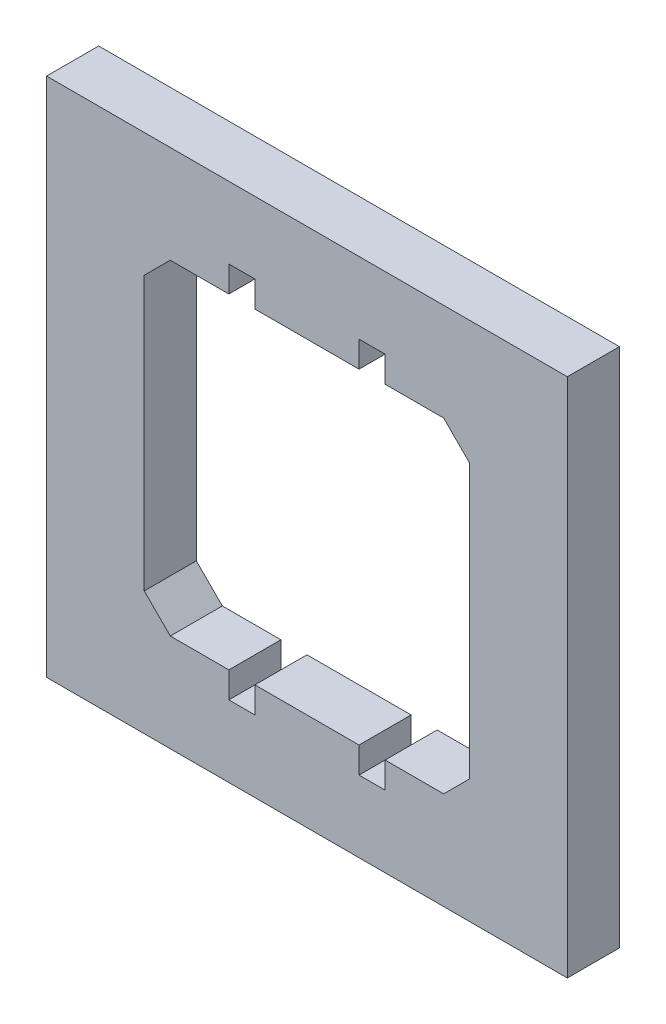
ISO-10303-21;
HEADER;
FILE_DESCRIPTION(('STEP AP214'),'2;1');
FILE_NAME('part.step','',(''),(''),'','','');
FILE_SCHEMA(('AUTOMOTIVE_DESIGN { 1 0 10303 214 1 1 1 1 }'));
ENDSEC;
DATA;
#1=APPLICATION_CONTEXT('core data for automotive mechanical design processes');
#2=APPLICATION_PROTOCOL_DEFINITION('international standard','automotive_design',2000,#1);
#3=PRODUCT_CONTEXT('',#1,'mechanical');
#4=PRODUCT('Part','Part','',(#3));
#5=PRODUCT_RELATED_PRODUCT_CATEGORY('part','',(#4));
#6=PRODUCT_DEFINITION_FORMATION('','',#4);
#7=PRODUCT_DEFINITION_CONTEXT('part definition',#1,'design');
#8=PRODUCT_DEFINITION('design','',#6,#7);
#9=PRODUCT_DEFINITION_SHAPE('','',#8);
#10=(LENGTH_UNIT() NAMED_UNIT(*) SI_UNIT(.MILLI.,.METRE.));
#11=(NAMED_UNIT(*) PLANE_ANGLE_UNIT() SI_UNIT($,.RADIAN.));
#12=(NAMED_UNIT(*) SI_UNIT($,.STERADIAN.) SOLID_ANGLE_UNIT());
#13=UNCERTAINTY_MEASURE_WITH_UNIT(LENGTH_MEASURE(1.E-05),#10,'distance_accuracy_value','');
#14=(GEOMETRIC_REPRESENTATION_CONTEXT(3) GLOBAL_UNCERTAINTY_ASSIGNED_CONTEXT((#13)) GLOBAL_UNIT_ASSIGNED_CONTEXT((#10,
#11,#12)) REPRESENTATION_CONTEXT('',''));
#15=CARTESIAN_POINT('',(0.,0.,0.));
#16=DIRECTION('',(0.,0.,1.));
#17=DIRECTION('',(1.,0.,0.));
#18=AXIS2_PLACEMENT_3D('',#15,#16,#17);
#19=CARTESIAN_POINT('',(0.,-6.25,2.));
#20=DIRECTION('',(0.,1.,0.));
#21=DIRECTION('',(0.,0.,1.));
#22=AXIS2_PLACEMENT_3D('',#19,#20,#21);
#23=PLANE('',#22);
#24=DIRECTION('',(1.,0.,0.));
#25=VECTOR('',#24,1.);
#26=CARTESIAN_POINT('',(0.,-6.25,2.));
#27=LINE('',#26,#25);
#28=CARTESIAN_POINT('',(3.,-6.25,2.));
#29=VERTEX_POINT('',#28);
#30=CARTESIAN_POINT('',(5.25,-6.25,2.));
#31=VERTEX_POINT('',#30);
#32=EDGE_CURVE('E560',#29,#31,#27,.T.);
#33=ORIENTED_EDGE('',*,*,#32,.T.);
#34=DIRECTION('',(0.,0.,-1.));
#35=VECTOR('',#34,1.);
#36=CARTESIAN_POINT('',(5.25,-6.25,0.));
#37=LINE('',#36,#35);
#38=CARTESIAN_POINT('',(5.25,-6.25,0.));
#39=VERTEX_POINT('',#38);
#40=EDGE_CURVE('E275',#31,#39,#37,.T.);
#41=ORIENTED_EDGE('',*,*,#40,.T.);
#42=DIRECTION('',(1.,0.,0.));
#43=VECTOR('',#42,1.);
#44=CARTESIAN_POINT('',(0.,-6.25,0.));
#45=LINE('',#44,#43);
#46=CARTESIAN_POINT('',(3.,-6.25,0.));
#47=VERTEX_POINT('',#46);
#48=EDGE_CURVE('E390',#47,#39,#45,.T.);
#49=ORIENTED_EDGE('',*,*,#48,.F.);
#50=DIRECTION('',(0.,0.,-1.));
#51=VECTOR('',#50,1.);
#52=CARTESIAN_POINT('',(3.,-6.25,2.));
#53=LINE('',#52,#51);
#54=EDGE_CURVE('E268',#29,#47,#53,.T.);
#55=ORIENTED_EDGE('',*,*,#54,.F.);
#56=EDGE_LOOP('',(#33,#41,#49,#55));
#57=FACE_BOUND('',#56,.T.);
#58=ADVANCED_FACE('F41',(#57),#23,.T.);
#59=CARTESIAN_POINT('',(3.,0.,2.));
#60=DIRECTION('',(1.,0.,0.));
#61=DIRECTION('',(0.,0.,-1.));
#62=AXIS2_PLACEMENT_3D('',#59,#60,#61);
#63=PLANE('',#62);
#64=DIRECTION('',(0.,-1.,0.));
#65=VECTOR('',#64,1.);
#66=CARTESIAN_POINT('',(3.,0.,0.));
#67=LINE('',#66,#65);
#68=CARTESIAN_POINT('',(3.,-7.25,0.));
#69=VERTEX_POINT('',#68);
#70=EDGE_CURVE('E393',#47,#69,#67,.T.);
#71=ORIENTED_EDGE('',*,*,#70,.T.);
#72=DIRECTION('',(0.,0.,-1.));
#73=VECTOR('',#72,1.);
#74=CARTESIAN_POINT('',(3.,-7.25,2.));
#75=LINE('',#74,#73);
#76=CARTESIAN_POINT('',(3.,-7.25,2.));
#77=VERTEX_POINT('',#76);
#78=EDGE_CURVE('E490',#77,#69,#75,.T.);
#79=ORIENTED_EDGE('',*,*,#78,.F.);
#80=DIRECTION('',(0.,-1.,0.));
#81=VECTOR('',#80,1.);
#82=CARTESIAN_POINT('',(3.,0.,2.));
#83=LINE('',#82,#81);
#84=EDGE_CURVE('E571',#29,#77,#83,.T.);
#85=ORIENTED_EDGE('',*,*,#84,.F.);
#86=ORIENTED_EDGE('',*,*,#54,.T.);
#87=EDGE_LOOP('',(#71,#79,#85,#86));
#88=FACE_BOUND('',#87,.T.);
#89=ADVANCED_FACE('F518',(#88),#63,.F.);
#90=CARTESIAN_POINT('',(0.,-7.25,2.));
#91=DIRECTION('',(0.,1.,0.));
#92=DIRECTION('',(-1.,0.,0.));
#93=AXIS2_PLACEMENT_3D('',#90,#91,#92);
#94=PLANE('',#93);
#95=DIRECTION('',(1.,0.,0.));
#96=VECTOR('',#95,1.);
#97=CARTESIAN_POINT('',(0.,-7.25,0.));
#98=LINE('',#97,#96);
#99=CARTESIAN_POINT('',(2.,-7.25,0.));
#100=VERTEX_POINT('',#99);
#101=EDGE_CURVE('E398',#100,#69,#98,.T.);
#102=ORIENTED_EDGE('',*,*,#101,.F.);
#103=DIRECTION('',(0.,0.,-1.));
#104=VECTOR('',#103,1.);
#105=CARTESIAN_POINT('',(2.,-7.25,2.));
#106=LINE('',#105,#104);
#107=CARTESIAN_POINT('',(2.,-7.25,2.));
#108=VERTEX_POINT('',#107);
#109=EDGE_CURVE('E487',#108,#100,#106,.T.);
#110=ORIENTED_EDGE('',*,*,#109,.F.);
#111=DIRECTION('',(1.,0.,0.));
#112=VECTOR('',#111,1.);
#113=CARTESIAN_POINT('',(0.,-7.25,2.));
#114=LINE('',#113,#112);
#115=EDGE_CURVE('E575',#108,#77,#114,.T.);
#116=ORIENTED_EDGE('',*,*,#115,.T.);
#117=ORIENTED_EDGE('',*,*,#78,.T.);
#118=EDGE_LOOP('',(#102,#110,#116,#117));
#119=FACE_BOUND('',#118,.T.);
#120=ADVANCED_FACE('F526',(#119),#94,.T.);
#121=CARTESIAN_POINT('',(2.,0.,2.));
#122=DIRECTION('',(1.,0.,0.));
#123=DIRECTION('',(0.,1.,0.));
#124=AXIS2_PLACEMENT_3D('',#121,#122,#123);
#125=PLANE('',#124);
#126=DIRECTION('',(0.,-1.,0.));
#127=VECTOR('',#126,1.);
#128=CARTESIAN_POINT('',(2.,0.,0.));
#129=LINE('',#128,#127);
#130=CARTESIAN_POINT('',(2.,-6.25,0.));
#131=VERTEX_POINT('',#130);
#132=EDGE_CURVE('E402',#131,#100,#129,.T.);
#133=ORIENTED_EDGE('',*,*,#132,.F.);
#134=DIRECTION('',(0.,0.,-1.));
#135=VECTOR('',#134,1.);
#136=CARTESIAN_POINT('',(2.,-6.25,2.));
#137=LINE('',#136,#135);
#138=CARTESIAN_POINT('',(2.,-6.25,2.));
#139=VERTEX_POINT('',#138);
#140=EDGE_CURVE('E484',#139,#131,#137,.T.);
#141=ORIENTED_EDGE('',*,*,#140,.F.);
#142=DIRECTION('',(0.,-1.,0.));
#143=VECTOR('',#142,1.);
#144=CARTESIAN_POINT('',(2.,0.,2.));
#145=LINE('',#144,#143);
#146=EDGE_CURVE('E569',#139,#108,#145,.T.);
#147=ORIENTED_EDGE('',*,*,#146,.T.);
#148=ORIENTED_EDGE('',*,*,#109,.T.);
#149=EDGE_LOOP('',(#133,#141,#147,#148));
#150=FACE_BOUND('',#149,.T.);
#151=ADVANCED_FACE('F534',(#150),#125,.T.);
#152=CARTESIAN_POINT('',(-2.,-6.25,0.));
#153=VERTEX_POINT('',#152);
#154=EDGE_CURVE('E394',#153,#131,#45,.T.);
#155=ORIENTED_EDGE('',*,*,#154,.F.);
#156=DIRECTION('',(0.,0.,-1.));
#157=VECTOR('',#156,1.);
#158=CARTESIAN_POINT('',(-2.,-6.25,2.));
#159=LINE('',#158,#157);
#160=CARTESIAN_POINT('',(-2.,-6.25,2.));
#161=VERTEX_POINT('',#160);
#162=EDGE_CURVE('E481',#161,#153,#159,.T.);
#163=ORIENTED_EDGE('',*,*,#162,.F.);
#164=EDGE_CURVE('E559',#161,#139,#27,.T.);
#165=ORIENTED_EDGE('',*,*,#164,.T.);
#166=ORIENTED_EDGE('',*,*,#140,.T.);
#167=EDGE_LOOP('',(#155,#163,#165,#166));
#168=FACE_BOUND('',#167,.T.);
#169=ADVANCED_FACE('F521',(#168),#23,.T.);
#170=CARTESIAN_POINT('',(-2.,0.,2.));
#171=DIRECTION('',(1.,0.,0.));
#172=DIRECTION('',(0.,1.,0.));
#173=AXIS2_PLACEMENT_3D('',#170,#171,#172);
#174=PLANE('',#173);
#175=DIRECTION('',(0.,-1.,0.));
#176=VECTOR('',#175,1.);
#177=CARTESIAN_POINT('',(-2.,0.,0.));
#178=LINE('',#177,#176);
#179=CARTESIAN_POINT('',(-2.,-7.25,0.));
#180=VERTEX_POINT('',#179);
#181=EDGE_CURVE('E406',#153,#180,#178,.T.);
#182=ORIENTED_EDGE('',*,*,#181,.T.);
#183=DIRECTION('',(0.,0.,-1.));
#184=VECTOR('',#183,1.);
#185=CARTESIAN_POINT('',(-2.,-7.25,2.));
#186=LINE('',#185,#184);
#187=CARTESIAN_POINT('',(-2.,-7.25,2.));
#188=VERTEX_POINT('',#187);
#189=EDGE_CURVE('E478',#188,#180,#186,.T.);
#190=ORIENTED_EDGE('',*,*,#189,.F.);
#191=DIRECTION('',(0.,-1.,0.));
#192=VECTOR('',#191,1.);
#193=CARTESIAN_POINT('',(-2.,0.,2.));
#194=LINE('',#193,#192);
#195=EDGE_CURVE('E568',#161,#188,#194,.T.);
#196=ORIENTED_EDGE('',*,*,#195,.F.);
#197=ORIENTED_EDGE('',*,*,#162,.T.);
#198=EDGE_LOOP('',(#182,#190,#196,#197));
#199=FACE_BOUND('',#198,.T.);
#200=ADVANCED_FACE('F533',(#199),#174,.F.);
#201=CARTESIAN_POINT('',(0.,-7.25,2.));
#202=DIRECTION('',(0.,1.,0.));
#203=DIRECTION('',(0.,0.,1.));
#204=AXIS2_PLACEMENT_3D('',#201,#202,#203);
#205=PLANE('',#204);
#206=DIRECTION('',(1.,0.,0.));
#207=VECTOR('',#206,1.);
#208=CARTESIAN_POINT('',(0.,-7.25,0.));
#209=LINE('',#208,#207);
#210=CARTESIAN_POINT('',(-3.,-7.25,0.));
#211=VERTEX_POINT('',#210);
#212=EDGE_CURVE('E410',#211,#180,#209,.T.);
#213=ORIENTED_EDGE('',*,*,#212,.F.);
#214=DIRECTION('',(0.,0.,-1.));
#215=VECTOR('',#214,1.);
#216=CARTESIAN_POINT('',(-3.,-7.25,2.));
#217=LINE('',#216,#215);
#218=CARTESIAN_POINT('',(-3.,-7.25,2.));
#219=VERTEX_POINT('',#218);
#220=EDGE_CURVE('E475',#219,#211,#217,.T.);
#221=ORIENTED_EDGE('',*,*,#220,.F.);
#222=DIRECTION('',(1.,0.,0.));
#223=VECTOR('',#222,1.);
#224=CARTESIAN_POINT('',(0.,-7.25,2.));
#225=LINE('',#224,#223);
#226=EDGE_CURVE('E562',#219,#188,#225,.T.);
#227=ORIENTED_EDGE('',*,*,#226,.T.);
#228=ORIENTED_EDGE('',*,*,#189,.T.);
#229=EDGE_LOOP('',(#213,#221,#227,#228));
#230=FACE_BOUND('',#229,.T.);
#231=ADVANCED_FACE('F543',(#230),#205,.T.);
#232=CARTESIAN_POINT('',(-3.00000000000001,0.,2.));
#233=DIRECTION('',(1.,0.,0.));
#234=DIRECTION('',(0.,1.,0.));
#235=AXIS2_PLACEMENT_3D('',#232,#233,#234);
#236=PLANE('',#235);
#237=DIRECTION('',(0.,-1.,0.));
#238=VECTOR('',#237,1.);
#239=CARTESIAN_POINT('',(-3.00000000000001,0.,0.));
#240=LINE('',#239,#238);
#241=CARTESIAN_POINT('',(-3.,-6.25,0.));
#242=VERTEX_POINT('',#241);
#243=EDGE_CURVE('E414',#242,#211,#240,.T.);
#244=ORIENTED_EDGE('',*,*,#243,.F.);
#245=DIRECTION('',(0.,0.,-1.));
#246=VECTOR('',#245,1.);
#247=CARTESIAN_POINT('',(-3.,-6.25,2.));
#248=LINE('',#247,#246);
#249=CARTESIAN_POINT('',(-3.,-6.25,2.));
#250=VERTEX_POINT('',#249);
#251=EDGE_CURVE('E471',#250,#242,#248,.T.);
#252=ORIENTED_EDGE('',*,*,#251,.F.);
#253=DIRECTION('',(0.,-1.,0.));
#254=VECTOR('',#253,1.);
#255=CARTESIAN_POINT('',(-3.00000000000001,0.,2.));
#256=LINE('',#255,#254);
#257=EDGE_CURVE('E556',#250,#219,#256,.T.);
#258=ORIENTED_EDGE('',*,*,#257,.T.);
#259=ORIENTED_EDGE('',*,*,#220,.T.);
#260=EDGE_LOOP('',(#244,#252,#258,#259));
#261=FACE_BOUND('',#260,.T.);
#262=ADVANCED_FACE('F537',(#261),#236,.T.);
#263=CARTESIAN_POINT('',(-5.25,-6.25,0.));
#264=VERTEX_POINT('',#263);
#265=EDGE_CURVE('E324',#264,#242,#45,.T.);
#266=ORIENTED_EDGE('',*,*,#265,.F.);
#267=DIRECTION('',(0.,0.,1.));
#268=VECTOR('',#267,1.);
#269=CARTESIAN_POINT('',(-5.25,-6.25,2.));
#270=LINE('',#269,#268);
#271=CARTESIAN_POINT('',(-5.25,-6.25,2.));
#272=VERTEX_POINT('',#271);
#273=EDGE_CURVE('E272',#264,#272,#270,.T.);
#274=ORIENTED_EDGE('',*,*,#273,.T.);
#275=EDGE_CURVE('E344',#272,#250,#27,.T.);
#276=ORIENTED_EDGE('',*,*,#275,.T.);
#277=ORIENTED_EDGE('',*,*,#251,.T.);
#278=EDGE_LOOP('',(#266,#274,#276,#277));
#279=FACE_BOUND('',#278,.T.);
#280=ADVANCED_FACE('F522',(#279),#23,.T.);
#281=CARTESIAN_POINT('',(-6.25,0.,2.));
#282=DIRECTION('',(-1.,0.,0.));
#283=DIRECTION('',(0.,0.,1.));
#284=AXIS2_PLACEMENT_3D('',#281,#282,#283);
#285=PLANE('',#284);
#286=DIRECTION('',(0.,1.,0.));
#287=VECTOR('',#286,1.);
#288=CARTESIAN_POINT('',(-6.25,0.,2.));
#289=LINE('',#288,#287);
#290=CARTESIAN_POINT('',(-6.25,-5.24999999999999,2.));
#291=VERTEX_POINT('',#290);
#292=CARTESIAN_POINT('',(-6.25,5.25000000000001,2.));
#293=VERTEX_POINT('',#292);
#294=EDGE_CURVE('E336',#291,#293,#289,.T.);
#295=ORIENTED_EDGE('',*,*,#294,.F.);
#296=DIRECTION('',(0.,0.,-1.));
#297=VECTOR('',#296,1.);
#298=CARTESIAN_POINT('',(-6.25,-5.24999999999999,2.));
#299=LINE('',#298,#297);
#300=CARTESIAN_POINT('',(-6.25,-5.24999999999999,0.));
#301=VERTEX_POINT('',#300);
#302=EDGE_CURVE('E267',#291,#301,#299,.T.);
#303=ORIENTED_EDGE('',*,*,#302,.T.);
#304=DIRECTION('',(0.,1.,0.));
#305=VECTOR('',#304,1.);
#306=CARTESIAN_POINT('',(-6.25,0.,0.));
#307=LINE('',#306,#305);
#308=CARTESIAN_POINT('',(-6.25,5.25000000000001,0.));
#309=VERTEX_POINT('',#308);
#310=EDGE_CURVE('E316',#301,#309,#307,.T.);
#311=ORIENTED_EDGE('',*,*,#310,.T.);
#312=DIRECTION('',(0.,0.,1.));
#313=VECTOR('',#312,1.);
#314=CARTESIAN_POINT('',(-6.25,5.25000000000001,2.));
#315=LINE('',#314,#313);
#316=EDGE_CURVE('E264',#309,#293,#315,.T.);
#317=ORIENTED_EDGE('',*,*,#316,.T.);
#318=EDGE_LOOP('',(#295,#303,#311,#317));
#319=FACE_BOUND('',#318,.T.);
#320=ADVANCED_FACE('F321',(#319),#285,.F.);
#321=CARTESIAN_POINT('',(0.,6.25,2.));
#322=DIRECTION('',(0.,1.,0.));
#323=DIRECTION('',(0.,0.,1.));
#324=AXIS2_PLACEMENT_3D('',#321,#322,#323);
#325=PLANE('',#324);
#326=DIRECTION('',(1.,0.,0.));
#327=VECTOR('',#326,1.);
#328=CARTESIAN_POINT('',(0.,6.25,2.));
#329=LINE('',#328,#327);
#330=CARTESIAN_POINT('',(-5.24999999999999,6.25,2.));
#331=VERTEX_POINT('',#330);
#332=CARTESIAN_POINT('',(-3.,6.25,2.));
#333=VERTEX_POINT('',#332);
#334=EDGE_CURVE('E329',#331,#333,#329,.T.);
#335=ORIENTED_EDGE('',*,*,#334,.F.);
#336=DIRECTION('',(0.,0.,-1.));
#337=VECTOR('',#336,1.);
#338=CARTESIAN_POINT('',(-5.24999999999999,6.25,0.));
#339=LINE('',#338,#337);
#340=CARTESIAN_POINT('',(-5.24999999999999,6.25,0.));
#341=VERTEX_POINT('',#340);
#342=EDGE_CURVE('E289',#331,#341,#339,.T.);
#343=ORIENTED_EDGE('',*,*,#342,.T.);
#344=DIRECTION('',(1.,0.,0.));
#345=VECTOR('',#344,1.);
#346=CARTESIAN_POINT('',(0.,6.25,0.));
#347=LINE('',#346,#345);
#348=CARTESIAN_POINT('',(-3.,6.25,0.));
#349=VERTEX_POINT('',#348);
#350=EDGE_CURVE('E318',#341,#349,#347,.T.);
#351=ORIENTED_EDGE('',*,*,#350,.T.);
#352=DIRECTION('',(0.,0.,-1.));
#353=VECTOR('',#352,1.);
#354=CARTESIAN_POINT('',(-3.,6.25,2.));
#355=LINE('',#354,#353);
#356=EDGE_CURVE('E331',#333,#349,#355,.T.);
#357=ORIENTED_EDGE('',*,*,#356,.F.);
#358=EDGE_LOOP('',(#335,#343,#351,#357));
#359=FACE_BOUND('',#358,.T.);
#360=ADVANCED_FACE('F327',(#359),#325,.F.);
#361=CARTESIAN_POINT('',(-3.,0.,2.));
#362=DIRECTION('',(-1.,0.,0.));
#363=DIRECTION('',(0.,0.,1.));
#364=AXIS2_PLACEMENT_3D('',#361,#362,#363);
#365=PLANE('',#364);
#366=DIRECTION('',(0.,1.,0.));
#367=VECTOR('',#366,1.);
#368=CARTESIAN_POINT('',(-3.,0.,0.));
#369=LINE('',#368,#367);
#370=CARTESIAN_POINT('',(-3.,7.25,0.));
#371=VERTEX_POINT('',#370);
#372=EDGE_CURVE('E420',#349,#371,#369,.T.);
#373=ORIENTED_EDGE('',*,*,#372,.T.);
#374=DIRECTION('',(0.,0.,-1.));
#375=VECTOR('',#374,1.);
#376=CARTESIAN_POINT('',(-3.,7.25,2.));
#377=LINE('',#376,#375);
#378=CARTESIAN_POINT('',(-3.,7.25,2.));
#379=VERTEX_POINT('',#378);
#380=EDGE_CURVE('E465',#379,#371,#377,.T.);
#381=ORIENTED_EDGE('',*,*,#380,.F.);
#382=DIRECTION('',(0.,1.,0.));
#383=VECTOR('',#382,1.);
#384=CARTESIAN_POINT('',(-3.,0.,2.));
#385=LINE('',#384,#383);
#386=EDGE_CURVE('E335',#333,#379,#385,.T.);
#387=ORIENTED_EDGE('',*,*,#386,.F.);
#388=ORIENTED_EDGE('',*,*,#356,.T.);
#389=EDGE_LOOP('',(#373,#381,#387,#388));
#390=FACE_BOUND('',#389,.T.);
#391=ADVANCED_FACE('F635',(#390),#365,.F.);
#392=CARTESIAN_POINT('',(0.,7.25,2.));
#393=DIRECTION('',(0.,1.,0.));
#394=DIRECTION('',(0.,0.,1.));
#395=AXIS2_PLACEMENT_3D('',#392,#393,#394);
#396=PLANE('',#395);
#397=DIRECTION('',(1.,0.,0.));
#398=VECTOR('',#397,1.);
#399=CARTESIAN_POINT('',(0.,7.25,0.));
#400=LINE('',#399,#398);
#401=CARTESIAN_POINT('',(-2.,7.25,0.));
#402=VERTEX_POINT('',#401);
#403=EDGE_CURVE('E426',#371,#402,#400,.T.);
#404=ORIENTED_EDGE('',*,*,#403,.T.);
#405=DIRECTION('',(0.,0.,-1.));
#406=VECTOR('',#405,1.);
#407=CARTESIAN_POINT('',(-2.,7.25,2.));
#408=LINE('',#407,#406);
#409=CARTESIAN_POINT('',(-2.,7.25,2.));
#410=VERTEX_POINT('',#409);
#411=EDGE_CURVE('E462',#410,#402,#408,.T.);
#412=ORIENTED_EDGE('',*,*,#411,.F.);
#413=DIRECTION('',(1.,0.,0.));
#414=VECTOR('',#413,1.);
#415=CARTESIAN_POINT('',(0.,7.25,2.));
#416=LINE('',#415,#414);
#417=EDGE_CURVE('E342',#379,#410,#416,.T.);
#418=ORIENTED_EDGE('',*,*,#417,.F.);
#419=ORIENTED_EDGE('',*,*,#380,.T.);
#420=EDGE_LOOP('',(#404,#412,#418,#419));
#421=FACE_BOUND('',#420,.T.);
#422=ADVANCED_FACE('F632',(#421),#396,.F.);
#423=CARTESIAN_POINT('',(-2.,0.,2.));
#424=DIRECTION('',(-1.,0.,0.));
#425=DIRECTION('',(0.,0.,1.));
#426=AXIS2_PLACEMENT_3D('',#423,#424,#425);
#427=PLANE('',#426);
#428=DIRECTION('',(0.,1.,0.));
#429=VECTOR('',#428,1.);
#430=CARTESIAN_POINT('',(-2.,0.,0.));
#431=LINE('',#430,#429);
#432=CARTESIAN_POINT('',(-2.,6.25,0.));
#433=VERTEX_POINT('',#432);
#434=EDGE_CURVE('E430',#433,#402,#431,.T.);
#435=ORIENTED_EDGE('',*,*,#434,.F.);
#436=DIRECTION('',(0.,0.,-1.));
#437=VECTOR('',#436,1.);
#438=CARTESIAN_POINT('',(-2.,6.25,2.));
#439=LINE('',#438,#437);
#440=CARTESIAN_POINT('',(-2.,6.25,2.));
#441=VERTEX_POINT('',#440);
#442=EDGE_CURVE('E459',#441,#433,#439,.T.);
#443=ORIENTED_EDGE('',*,*,#442,.F.);
#444=DIRECTION('',(0.,1.,0.));
#445=VECTOR('',#444,1.);
#446=CARTESIAN_POINT('',(-2.,0.,2.));
#447=LINE('',#446,#445);
#448=EDGE_CURVE('E353',#441,#410,#447,.T.);
#449=ORIENTED_EDGE('',*,*,#448,.T.);
#450=ORIENTED_EDGE('',*,*,#411,.T.);
#451=EDGE_LOOP('',(#435,#443,#449,#450));
#452=FACE_BOUND('',#451,.T.);
#453=ADVANCED_FACE('F629',(#452),#427,.T.);
#454=CARTESIAN_POINT('',(2.,6.25,0.));
#455=VERTEX_POINT('',#454);
#456=EDGE_CURVE('E422',#433,#455,#347,.T.);
#457=ORIENTED_EDGE('',*,*,#456,.T.);
#458=DIRECTION('',(0.,0.,-1.));
#459=VECTOR('',#458,1.);
#460=CARTESIAN_POINT('',(2.,6.25,2.));
#461=LINE('',#460,#459);
#462=CARTESIAN_POINT('',(2.,6.25,2.));
#463=VERTEX_POINT('',#462);
#464=EDGE_CURVE('E455',#463,#455,#461,.T.);
#465=ORIENTED_EDGE('',*,*,#464,.F.);
#466=EDGE_CURVE('E339',#441,#463,#329,.T.);
#467=ORIENTED_EDGE('',*,*,#466,.F.);
#468=ORIENTED_EDGE('',*,*,#442,.T.);
#469=EDGE_LOOP('',(#457,#465,#467,#468));
#470=FACE_BOUND('',#469,.T.);
#471=ADVANCED_FACE('F627',(#470),#325,.F.);
#472=CARTESIAN_POINT('',(2.,0.,2.));
#473=DIRECTION('',(-1.,0.,0.));
#474=DIRECTION('',(0.,-1.,0.));
#475=AXIS2_PLACEMENT_3D('',#472,#473,#474);
#476=PLANE('',#475);
#477=DIRECTION('',(0.,1.,0.));
#478=VECTOR('',#477,1.);
#479=CARTESIAN_POINT('',(2.,0.,0.));
#480=LINE('',#479,#478);
#481=CARTESIAN_POINT('',(2.,7.25,0.));
#482=VERTEX_POINT('',#481);
#483=EDGE_CURVE('E434',#455,#482,#480,.T.);
#484=ORIENTED_EDGE('',*,*,#483,.T.);
#485=DIRECTION('',(0.,0.,-1.));
#486=VECTOR('',#485,1.);
#487=CARTESIAN_POINT('',(2.,7.25,2.));
#488=LINE('',#487,#486);
#489=CARTESIAN_POINT('',(2.,7.25,2.));
#490=VERTEX_POINT('',#489);
#491=EDGE_CURVE('E451',#490,#482,#488,.T.);
#492=ORIENTED_EDGE('',*,*,#491,.F.);
#493=DIRECTION('',(0.,1.,0.));
#494=VECTOR('',#493,1.);
#495=CARTESIAN_POINT('',(2.,0.,2.));
#496=LINE('',#495,#494);
#497=EDGE_CURVE('E352',#463,#490,#496,.T.);
#498=ORIENTED_EDGE('',*,*,#497,.F.);
#499=ORIENTED_EDGE('',*,*,#464,.T.);
#500=EDGE_LOOP('',(#484,#492,#498,#499));
#501=FACE_BOUND('',#500,.T.);
#502=ADVANCED_FACE('F625',(#501),#476,.F.);
#503=CARTESIAN_POINT('',(0.,7.25,2.));
#504=DIRECTION('',(0.,1.,0.));
#505=DIRECTION('',(-1.,0.,0.));
#506=AXIS2_PLACEMENT_3D('',#503,#504,#505);
#507=PLANE('',#506);
#508=DIRECTION('',(1.,0.,0.));
#509=VECTOR('',#508,1.);
#510=CARTESIAN_POINT('',(0.,7.25,0.));
#511=LINE('',#510,#509);
#512=CARTESIAN_POINT('',(3.,7.25,0.));
#513=VERTEX_POINT('',#512);
#514=EDGE_CURVE('E438',#482,#513,#511,.T.);
#515=ORIENTED_EDGE('',*,*,#514,.T.);
#516=DIRECTION('',(0.,0.,-1.));
#517=VECTOR('',#516,1.);
#518=CARTESIAN_POINT('',(3.,7.25,2.));
#519=LINE('',#518,#517);
#520=CARTESIAN_POINT('',(3.,7.25,2.));
#521=VERTEX_POINT('',#520);
#522=EDGE_CURVE('E258',#521,#513,#519,.T.);
#523=ORIENTED_EDGE('',*,*,#522,.F.);
#524=DIRECTION('',(1.,0.,0.));
#525=VECTOR('',#524,1.);
#526=CARTESIAN_POINT('',(0.,7.25,2.));
#527=LINE('',#526,#525);
#528=EDGE_CURVE('E360',#490,#521,#527,.T.);
#529=ORIENTED_EDGE('',*,*,#528,.F.);
#530=ORIENTED_EDGE('',*,*,#491,.T.);
#531=EDGE_LOOP('',(#515,#523,#529,#530));
#532=FACE_BOUND('',#531,.T.);
#533=ADVANCED_FACE('F623',(#532),#507,.F.);
#534=CARTESIAN_POINT('',(3.,0.,2.));
#535=DIRECTION('',(-1.,0.,0.));
#536=DIRECTION('',(0.,0.,1.));
#537=AXIS2_PLACEMENT_3D('',#534,#535,#536);
#538=PLANE('',#537);
#539=DIRECTION('',(0.,1.,0.));
#540=VECTOR('',#539,1.);
#541=CARTESIAN_POINT('',(3.,0.,0.));
#542=LINE('',#541,#540);
#543=CARTESIAN_POINT('',(3.,6.25,0.));
#544=VERTEX_POINT('',#543);
#545=EDGE_CURVE('E442',#544,#513,#542,.T.);
#546=ORIENTED_EDGE('',*,*,#545,.F.);
#547=DIRECTION('',(0.,0.,-1.));
#548=VECTOR('',#547,1.);
#549=CARTESIAN_POINT('',(3.,6.25,2.));
#550=LINE('',#549,#548);
#551=CARTESIAN_POINT('',(3.,6.25,2.));
#552=VERTEX_POINT('',#551);
#553=EDGE_CURVE('E254',#552,#544,#550,.T.);
#554=ORIENTED_EDGE('',*,*,#553,.F.);
#555=DIRECTION('',(0.,1.,0.));
#556=VECTOR('',#555,1.);
#557=CARTESIAN_POINT('',(3.,0.,2.));
#558=LINE('',#557,#556);
#559=EDGE_CURVE('E349',#552,#521,#558,.T.);
#560=ORIENTED_EDGE('',*,*,#559,.T.);
#561=ORIENTED_EDGE('',*,*,#522,.T.);
#562=EDGE_LOOP('',(#546,#554,#560,#561));
#563=FACE_BOUND('',#562,.T.);
#564=ADVANCED_FACE('F618',(#563),#538,.T.);
#565=CARTESIAN_POINT('',(5.25,6.25,0.));
#566=VERTEX_POINT('',#565);
#567=EDGE_CURVE('E421',#544,#566,#347,.T.);
#568=ORIENTED_EDGE('',*,*,#567,.T.);
#569=DIRECTION('',(0.,0.,1.));
#570=VECTOR('',#569,1.);
#571=CARTESIAN_POINT('',(5.25,6.25,2.));
#572=LINE('',#571,#570);
#573=CARTESIAN_POINT('',(5.25,6.25,2.));
#574=VERTEX_POINT('',#573);
#575=EDGE_CURVE('E286',#566,#574,#572,.T.);
#576=ORIENTED_EDGE('',*,*,#575,.T.);
#577=EDGE_CURVE('E338',#552,#574,#329,.T.);
#578=ORIENTED_EDGE('',*,*,#577,.F.);
#579=ORIENTED_EDGE('',*,*,#553,.T.);
#580=EDGE_LOOP('',(#568,#576,#578,#579));
#581=FACE_BOUND('',#580,.T.);
#582=ADVANCED_FACE('F614',(#581),#325,.F.);
#583=CARTESIAN_POINT('',(0.,-10.,2.));
#584=DIRECTION('',(0.,1.,0.));
#585=DIRECTION('',(0.,0.,1.));
#586=AXIS2_PLACEMENT_3D('',#583,#584,#585);
#587=PLANE('',#586);
#588=DIRECTION('',(1.,0.,0.));
#589=VECTOR('',#588,1.);
#590=CARTESIAN_POINT('',(0.,-10.,0.));
#591=LINE('',#590,#589);
#592=CARTESIAN_POINT('',(-10.,-10.,0.));
#593=VERTEX_POINT('',#592);
#594=CARTESIAN_POINT('',(10.,-10.,0.));
#595=VERTEX_POINT('',#594);
#596=EDGE_CURVE('E252',#593,#595,#591,.T.);
#597=ORIENTED_EDGE('',*,*,#596,.T.);
#598=DIRECTION('',(0.,0.,-1.));
#599=VECTOR('',#598,1.);
#600=CARTESIAN_POINT('',(10.,-10.,2.));
#601=LINE('',#600,#599);
#602=CARTESIAN_POINT('',(10.,-10.,2.));
#603=VERTEX_POINT('',#602);
#604=EDGE_CURVE('E231',#603,#595,#601,.T.);
#605=ORIENTED_EDGE('',*,*,#604,.F.);
#606=DIRECTION('',(1.,0.,0.));
#607=VECTOR('',#606,1.);
#608=CARTESIAN_POINT('',(0.,-10.,2.));
#609=LINE('',#608,#607);
#610=CARTESIAN_POINT('',(-10.,-10.,2.));
#611=VERTEX_POINT('',#610);
#612=EDGE_CURVE('E239',#611,#603,#609,.T.);
#613=ORIENTED_EDGE('',*,*,#612,.F.);
#614=DIRECTION('',(0.,0.,-1.));
#615=VECTOR('',#614,1.);
#616=CARTESIAN_POINT('',(-10.,-10.,2.));
#617=LINE('',#616,#615);
#618=EDGE_CURVE('E376',#611,#593,#617,.T.);
#619=ORIENTED_EDGE('',*,*,#618,.T.);
#620=EDGE_LOOP('',(#597,#605,#613,#619));
#621=FACE_BOUND('',#620,.T.);
#622=ADVANCED_FACE('F250',(#621),#587,.F.);
#623=CARTESIAN_POINT('',(10.,0.,2.));
#624=DIRECTION('',(-1.,0.,0.));
#625=DIRECTION('',(0.,0.,1.));
#626=AXIS2_PLACEMENT_3D('',#623,#624,#625);
#627=PLANE('',#626);
#628=DIRECTION('',(0.,1.,0.));
#629=VECTOR('',#628,1.);
#630=CARTESIAN_POINT('',(10.,0.,0.));
#631=LINE('',#630,#629);
#632=CARTESIAN_POINT('',(10.,10.,0.));
#633=VERTEX_POINT('',#632);
#634=EDGE_CURVE('E379',#595,#633,#631,.T.);
#635=ORIENTED_EDGE('',*,*,#634,.T.);
#636=DIRECTION('',(0.,0.,-1.));
#637=VECTOR('',#636,1.);
#638=CARTESIAN_POINT('',(10.,10.,2.));
#639=LINE('',#638,#637);
#640=CARTESIAN_POINT('',(10.,10.,2.));
#641=VERTEX_POINT('',#640);
#642=EDGE_CURVE('E233',#641,#633,#639,.T.);
#643=ORIENTED_EDGE('',*,*,#642,.F.);
#644=DIRECTION('',(0.,1.,0.));
#645=VECTOR('',#644,1.);
#646=CARTESIAN_POINT('',(10.,0.,2.));
#647=LINE('',#646,#645);
#648=EDGE_CURVE('E226',#603,#641,#647,.T.);
#649=ORIENTED_EDGE('',*,*,#648,.F.);
#650=ORIENTED_EDGE('',*,*,#604,.T.);
#651=EDGE_LOOP('',(#635,#643,#649,#650));
#652=FACE_BOUND('',#651,.T.);
#653=ADVANCED_FACE('F229',(#652),#627,.F.);
#654=CARTESIAN_POINT('',(0.,10.,2.));
#655=DIRECTION('',(0.,1.,0.));
#656=DIRECTION('',(0.,0.,1.));
#657=AXIS2_PLACEMENT_3D('',#654,#655,#656);
#658=PLANE('',#657);
#659=DIRECTION('',(1.,0.,0.));
#660=VECTOR('',#659,1.);
#661=CARTESIAN_POINT('',(0.,10.,0.));
#662=LINE('',#661,#660);
#663=CARTESIAN_POINT('',(-10.,10.,0.));
#664=VERTEX_POINT('',#663);
#665=EDGE_CURVE('E382',#664,#633,#662,.T.);
#666=ORIENTED_EDGE('',*,*,#665,.F.);
#667=DIRECTION('',(0.,0.,-1.));
#668=VECTOR('',#667,1.);
#669=CARTESIAN_POINT('',(-10.,10.,2.));
#670=LINE('',#669,#668);
#671=CARTESIAN_POINT('',(-10.,10.,2.));
#672=VERTEX_POINT('',#671);
#673=EDGE_CURVE('E260',#672,#664,#670,.T.);
#674=ORIENTED_EDGE('',*,*,#673,.F.);
#675=DIRECTION('',(1.,0.,0.));
#676=VECTOR('',#675,1.);
#677=CARTESIAN_POINT('',(0.,10.,2.));
#678=LINE('',#677,#676);
#679=EDGE_CURVE('E238',#672,#641,#678,.T.);
#680=ORIENTED_EDGE('',*,*,#679,.T.);
#681=ORIENTED_EDGE('',*,*,#642,.T.);
#682=EDGE_LOOP('',(#666,#674,#680,#681));
#683=FACE_BOUND('',#682,.T.);
#684=ADVANCED_FACE('F502',(#683),#658,.T.);
#685=CARTESIAN_POINT('',(-10.,0.,2.));
#686=DIRECTION('',(-1.,0.,0.));
#687=DIRECTION('',(0.,0.,1.));
#688=AXIS2_PLACEMENT_3D('',#685,#686,#687);
#689=PLANE('',#688);
#690=DIRECTION('',(0.,1.,0.));
#691=VECTOR('',#690,1.);
#692=CARTESIAN_POINT('',(-10.,0.,0.));
#693=LINE('',#692,#691);
#694=EDGE_CURVE('E386',#593,#664,#693,.T.);
#695=ORIENTED_EDGE('',*,*,#694,.F.);
#696=ORIENTED_EDGE('',*,*,#618,.F.);
#697=DIRECTION('',(0.,1.,0.));
#698=VECTOR('',#697,1.);
#699=CARTESIAN_POINT('',(-10.,0.,2.));
#700=LINE('',#699,#698);
#701=EDGE_CURVE('E245',#611,#672,#700,.T.);
#702=ORIENTED_EDGE('',*,*,#701,.T.);
#703=ORIENTED_EDGE('',*,*,#673,.T.);
#704=EDGE_LOOP('',(#695,#696,#702,#703));
#705=FACE_BOUND('',#704,.T.);
#706=ADVANCED_FACE('F500',(#705),#689,.T.);
#707=CARTESIAN_POINT('',(6.25,0.,2.));
#708=DIRECTION('',(-1.,0.,0.));
#709=DIRECTION('',(0.,0.,1.));
#710=AXIS2_PLACEMENT_3D('',#707,#708,#709);
#711=PLANE('',#710);
#712=DIRECTION('',(0.,1.,0.));
#713=VECTOR('',#712,1.);
#714=CARTESIAN_POINT('',(6.25,0.,0.));
#715=LINE('',#714,#713);
#716=CARTESIAN_POINT('',(6.25,-5.25000000000001,0.));
#717=VERTEX_POINT('',#716);
#718=CARTESIAN_POINT('',(6.25,5.24999999999999,0.));
#719=VERTEX_POINT('',#718);
#720=EDGE_CURVE('E248',#717,#719,#715,.T.);
#721=ORIENTED_EDGE('',*,*,#720,.F.);
#722=DIRECTION('',(0.,0.,1.));
#723=VECTOR('',#722,1.);
#724=CARTESIAN_POINT('',(6.25,-5.25000000000001,2.));
#725=LINE('',#724,#723);
#726=CARTESIAN_POINT('',(6.25,-5.25000000000001,2.));
#727=VERTEX_POINT('',#726);
#728=EDGE_CURVE('E283',#717,#727,#725,.T.);
#729=ORIENTED_EDGE('',*,*,#728,.T.);
#730=DIRECTION('',(0.,1.,0.));
#731=VECTOR('',#730,1.);
#732=CARTESIAN_POINT('',(6.25,0.,2.));
#733=LINE('',#732,#731);
#734=CARTESIAN_POINT('',(6.25,5.24999999999999,2.));
#735=VERTEX_POINT('',#734);
#736=EDGE_CURVE('E348',#727,#735,#733,.T.);
#737=ORIENTED_EDGE('',*,*,#736,.T.);
#738=DIRECTION('',(0.,0.,-1.));
#739=VECTOR('',#738,1.);
#740=CARTESIAN_POINT('',(6.25,5.24999999999999,2.));
#741=LINE('',#740,#739);
#742=EDGE_CURVE('E279',#735,#719,#741,.T.);
#743=ORIENTED_EDGE('',*,*,#742,.T.);
#744=EDGE_LOOP('',(#721,#729,#737,#743));
#745=FACE_BOUND('',#744,.T.);
#746=ADVANCED_FACE('F514',(#745),#711,.T.);
#747=CARTESIAN_POINT('',(0.,0.,2.));
#748=DIRECTION('',(0.,0.,1.));
#749=DIRECTION('',(1.,0.,0.));
#750=AXIS2_PLACEMENT_3D('',#747,#748,#749);
#751=PLANE('',#750);
#752=ORIENTED_EDGE('',*,*,#612,.T.);
#753=ORIENTED_EDGE('',*,*,#648,.T.);
#754=ORIENTED_EDGE('',*,*,#679,.F.);
#755=ORIENTED_EDGE('',*,*,#701,.F.);
#756=EDGE_LOOP('',(#752,#753,#754,#755));
#757=FACE_BOUND('',#756,.T.);
#758=ORIENTED_EDGE('',*,*,#32,.F.);
#759=ORIENTED_EDGE('',*,*,#84,.T.);
#760=ORIENTED_EDGE('',*,*,#115,.F.);
#761=ORIENTED_EDGE('',*,*,#146,.F.);
#762=ORIENTED_EDGE('',*,*,#164,.F.);
#763=ORIENTED_EDGE('',*,*,#195,.T.);
#764=ORIENTED_EDGE('',*,*,#226,.F.);
#765=ORIENTED_EDGE('',*,*,#257,.F.);
#766=ORIENTED_EDGE('',*,*,#275,.F.);
#767=DIRECTION('',(-0.707106781186544,0.707106781186551,0.));
#768=VECTOR('',#767,1.);
#769=CARTESIAN_POINT('',(-6.25,-5.24999999999999,2.));
#770=LINE('',#769,#768);
#771=EDGE_CURVE('E295',#272,#291,#770,.T.);
#772=ORIENTED_EDGE('',*,*,#771,.T.);
#773=ORIENTED_EDGE('',*,*,#294,.T.);
#774=DIRECTION('',(-0.707106781186551,-0.707106781186544,0.));
#775=VECTOR('',#774,1.);
#776=CARTESIAN_POINT('',(-5.24999999999999,6.25,2.));
#777=LINE('',#776,#775);
#778=EDGE_CURVE('E11',#293,#331,#777,.F.);
#779=ORIENTED_EDGE('',*,*,#778,.T.);
#780=ORIENTED_EDGE('',*,*,#334,.T.);
#781=ORIENTED_EDGE('',*,*,#386,.T.);
#782=ORIENTED_EDGE('',*,*,#417,.T.);
#783=ORIENTED_EDGE('',*,*,#448,.F.);
#784=ORIENTED_EDGE('',*,*,#466,.T.);
#785=ORIENTED_EDGE('',*,*,#497,.T.);
#786=ORIENTED_EDGE('',*,*,#528,.T.);
#787=ORIENTED_EDGE('',*,*,#559,.F.);
#788=ORIENTED_EDGE('',*,*,#577,.T.);
#789=DIRECTION('',(0.707106781186544,-0.707106781186551,0.));
#790=VECTOR('',#789,1.);
#791=CARTESIAN_POINT('',(6.25,5.24999999999999,2.));
#792=LINE('',#791,#790);
#793=EDGE_CURVE('E307',#574,#735,#792,.T.);
#794=ORIENTED_EDGE('',*,*,#793,.T.);
#795=ORIENTED_EDGE('',*,*,#736,.F.);
#796=DIRECTION('',(0.707106781186551,0.707106781186544,0.));
#797=VECTOR('',#796,1.);
#798=CARTESIAN_POINT('',(5.25,-6.25,2.));
#799=LINE('',#798,#797);
#800=EDGE_CURVE('E301',#727,#31,#799,.F.);
#801=ORIENTED_EDGE('',*,*,#800,.T.);
#802=EDGE_LOOP('',(#758,#759,#760,#761,#762,#763,#764,#765,#766,#772,#773,#779,#780,#781,#782,
#783,#784,#785,#786,#787,#788,#794,#795,#801));
#803=FACE_BOUND('',#802,.T.);
#804=ADVANCED_FACE('F243',(#757,#803),#751,.T.);
#805=CARTESIAN_POINT('',(0.,0.,0.));
#806=DIRECTION('',(0.,0.,1.));
#807=DIRECTION('',(1.,0.,0.));
#808=AXIS2_PLACEMENT_3D('',#805,#806,#807);
#809=PLANE('',#808);
#810=ORIENTED_EDGE('',*,*,#596,.F.);
#811=ORIENTED_EDGE('',*,*,#694,.T.);
#812=ORIENTED_EDGE('',*,*,#665,.T.);
#813=ORIENTED_EDGE('',*,*,#634,.F.);
#814=EDGE_LOOP('',(#810,#811,#812,#813));
#815=FACE_BOUND('',#814,.T.);
#816=ORIENTED_EDGE('',*,*,#48,.T.);
#817=DIRECTION('',(-0.707106781186551,-0.707106781186544,0.));
#818=VECTOR('',#817,1.);
#819=CARTESIAN_POINT('',(5.74999999999997,-5.75000000000003,0.));
#820=LINE('',#819,#818);
#821=EDGE_CURVE('E298',#39,#717,#820,.F.);
#822=ORIENTED_EDGE('',*,*,#821,.T.);
#823=ORIENTED_EDGE('',*,*,#720,.T.);
#824=DIRECTION('',(-0.707106781186544,0.707106781186551,0.));
#825=VECTOR('',#824,1.);
#826=CARTESIAN_POINT('',(5.75000000000003,5.74999999999997,0.));
#827=LINE('',#826,#825);
#828=EDGE_CURVE('E304',#719,#566,#827,.T.);
#829=ORIENTED_EDGE('',*,*,#828,.T.);
#830=ORIENTED_EDGE('',*,*,#567,.F.);
#831=ORIENTED_EDGE('',*,*,#545,.T.);
#832=ORIENTED_EDGE('',*,*,#514,.F.);
#833=ORIENTED_EDGE('',*,*,#483,.F.);
#834=ORIENTED_EDGE('',*,*,#456,.F.);
#835=ORIENTED_EDGE('',*,*,#434,.T.);
#836=ORIENTED_EDGE('',*,*,#403,.F.);
#837=ORIENTED_EDGE('',*,*,#372,.F.);
#838=ORIENTED_EDGE('',*,*,#350,.F.);
#839=DIRECTION('',(0.707106781186551,0.707106781186544,0.));
#840=VECTOR('',#839,1.);
#841=CARTESIAN_POINT('',(-5.74999999999997,5.75000000000003,0.));
#842=LINE('',#841,#840);
#843=EDGE_CURVE('E50',#341,#309,#842,.F.);
#844=ORIENTED_EDGE('',*,*,#843,.T.);
#845=ORIENTED_EDGE('',*,*,#310,.F.);
#846=DIRECTION('',(0.707106781186544,-0.707106781186551,0.));
#847=VECTOR('',#846,1.);
#848=CARTESIAN_POINT('',(-5.75000000000003,-5.74999999999997,0.));
#849=LINE('',#848,#847);
#850=EDGE_CURVE('E292',#301,#264,#849,.T.);
#851=ORIENTED_EDGE('',*,*,#850,.T.);
#852=ORIENTED_EDGE('',*,*,#265,.T.);
#853=ORIENTED_EDGE('',*,*,#243,.T.);
#854=ORIENTED_EDGE('',*,*,#212,.T.);
#855=ORIENTED_EDGE('',*,*,#181,.F.);
#856=ORIENTED_EDGE('',*,*,#154,.T.);
#857=ORIENTED_EDGE('',*,*,#132,.T.);
#858=ORIENTED_EDGE('',*,*,#101,.T.);
#859=ORIENTED_EDGE('',*,*,#70,.F.);
#860=EDGE_LOOP('',(#816,#822,#823,#829,#830,#831,#832,#833,#834,#835,#836,#837,#838,#844,#845,
#851,#852,#853,#854,#855,#856,#857,#858,#859));
#861=FACE_BOUND('',#860,.T.);
#862=ADVANCED_FACE('F315',(#815,#861),#809,.F.);
#863=CARTESIAN_POINT('',(-6.25,-5.24999999999999,2.));
#864=DIRECTION('',(-0.707106781186551,-0.707106781186544,0.));
#865=DIRECTION('',(0.,0.,-1.));
#866=AXIS2_PLACEMENT_3D('',#863,#864,#865);
#867=PLANE('',#866);
#868=ORIENTED_EDGE('',*,*,#771,.F.);
#869=ORIENTED_EDGE('',*,*,#273,.F.);
#870=ORIENTED_EDGE('',*,*,#850,.F.);
#871=ORIENTED_EDGE('',*,*,#302,.F.);
#872=EDGE_LOOP('',(#868,#869,#870,#871));
#873=FACE_BOUND('',#872,.T.);
#874=ADVANCED_FACE('F505',(#873),#867,.F.);
#875=CARTESIAN_POINT('',(5.25,-6.25,2.));
#876=DIRECTION('',(-0.707106781186544,0.707106781186551,0.));
#877=DIRECTION('',(0.,0.,1.));
#878=AXIS2_PLACEMENT_3D('',#875,#876,#877);
#879=PLANE('',#878);
#880=ORIENTED_EDGE('',*,*,#800,.F.);
#881=ORIENTED_EDGE('',*,*,#728,.F.);
#882=ORIENTED_EDGE('',*,*,#821,.F.);
#883=ORIENTED_EDGE('',*,*,#40,.F.);
#884=EDGE_LOOP('',(#880,#881,#882,#883));
#885=FACE_BOUND('',#884,.T.);
#886=ADVANCED_FACE('F511',(#885),#879,.T.);
#887=CARTESIAN_POINT('',(6.25,5.24999999999999,2.));
#888=DIRECTION('',(0.707106781186551,0.707106781186544,0.));
#889=DIRECTION('',(0.,0.,-1.));
#890=AXIS2_PLACEMENT_3D('',#887,#888,#889);
#891=PLANE('',#890);
#892=ORIENTED_EDGE('',*,*,#793,.F.);
#893=ORIENTED_EDGE('',*,*,#575,.F.);
#894=ORIENTED_EDGE('',*,*,#828,.F.);
#895=ORIENTED_EDGE('',*,*,#742,.F.);
#896=EDGE_LOOP('',(#892,#893,#894,#895));
#897=FACE_BOUND('',#896,.T.);
#898=ADVANCED_FACE('F609',(#897),#891,.F.);
#899=CARTESIAN_POINT('',(-5.24999999999999,6.25,2.));
#900=DIRECTION('',(0.707106781186544,-0.707106781186551,0.));
#901=DIRECTION('',(0.,0.,1.));
#902=AXIS2_PLACEMENT_3D('',#899,#900,#901);
#903=PLANE('',#902);
#904=ORIENTED_EDGE('',*,*,#778,.F.);
#905=ORIENTED_EDGE('',*,*,#316,.F.);
#906=ORIENTED_EDGE('',*,*,#843,.F.);
#907=ORIENTED_EDGE('',*,*,#342,.F.);
#908=EDGE_LOOP('',(#904,#905,#906,#907));
#909=FACE_BOUND('',#908,.T.);
#910=ADVANCED_FACE('F43',(#909),#903,.T.);
#911=CLOSED_SHELL('',(#58,#89,#120,#151,#169,#200,#231,#262,#280,#320,#360,#391,#422,#453,#471,
#502,#533,#564,#582,#622,#653,#684,#706,#746,#804,#862,#874,#886,#898,#910));
#912=MANIFOLD_SOLID_BREP('B2',#911);
#913=ADVANCED_BREP_SHAPE_REPRESENTATION('',(#18,#912),#14);
#914=SHAPE_DEFINITION_REPRESENTATION(#9,#913);
ENDSEC;
END-ISO-10303-21;
